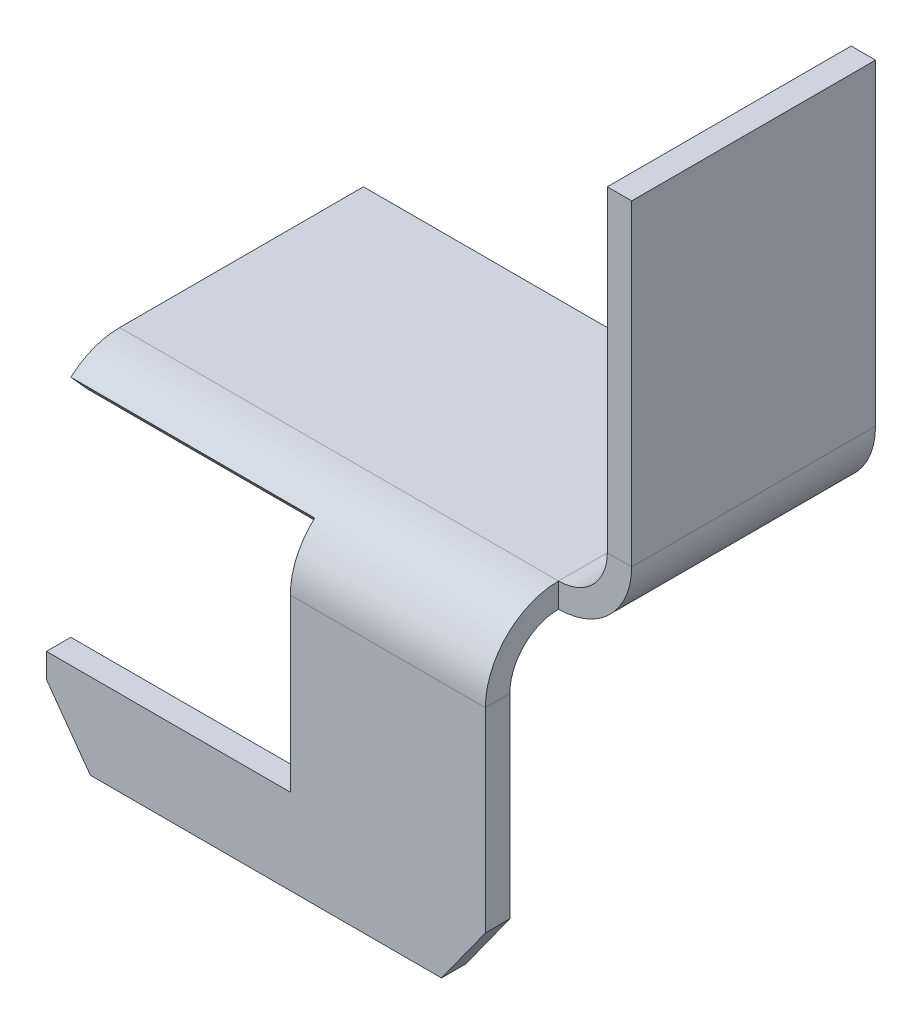
ISO-10303-21;
HEADER;
FILE_DESCRIPTION(('STEP AP214'),'2;1');
FILE_NAME('part.step','',(''),(''),'','','');
FILE_SCHEMA(('AUTOMOTIVE_DESIGN { 1 0 10303 214 1 1 1 1 }'));
ENDSEC;
DATA;
#1=APPLICATION_CONTEXT('core data for automotive mechanical design processes');
#2=APPLICATION_PROTOCOL_DEFINITION('international standard','automotive_design',2000,#1);
#3=PRODUCT_CONTEXT('',#1,'mechanical');
#4=PRODUCT('Part','Part','',(#3));
#5=PRODUCT_RELATED_PRODUCT_CATEGORY('part','',(#4));
#6=PRODUCT_DEFINITION_FORMATION('','',#4);
#7=PRODUCT_DEFINITION_CONTEXT('part definition',#1,'design');
#8=PRODUCT_DEFINITION('design','',#6,#7);
#9=PRODUCT_DEFINITION_SHAPE('','',#8);
#10=(LENGTH_UNIT() NAMED_UNIT(*) SI_UNIT(.MILLI.,.METRE.));
#11=(NAMED_UNIT(*) PLANE_ANGLE_UNIT() SI_UNIT($,.RADIAN.));
#12=(NAMED_UNIT(*) SI_UNIT($,.STERADIAN.) SOLID_ANGLE_UNIT());
#13=UNCERTAINTY_MEASURE_WITH_UNIT(LENGTH_MEASURE(1.E-05),#10,'distance_accuracy_value','');
#14=(GEOMETRIC_REPRESENTATION_CONTEXT(3) GLOBAL_UNCERTAINTY_ASSIGNED_CONTEXT((#13)) GLOBAL_UNIT_ASSIGNED_CONTEXT((#10,
#11,#12)) REPRESENTATION_CONTEXT('',''));
#15=CARTESIAN_POINT('',(0.,0.,0.));
#16=DIRECTION('',(0.,0.,1.));
#17=DIRECTION('',(1.,0.,0.));
#18=AXIS2_PLACEMENT_3D('',#15,#16,#17);
#19=CARTESIAN_POINT('',(0.,0.,13.));
#20=DIRECTION('',(0.,0.,1.));
#21=DIRECTION('',(0.,-1.,0.));
#22=AXIS2_PLACEMENT_3D('',#19,#20,#21);
#23=PLANE('',#22);
#24=DIRECTION('',(-1.,0.,0.));
#25=VECTOR('',#24,1.);
#26=CARTESIAN_POINT('',(0.,-2.99999999999999,13.));
#27=LINE('',#26,#25);
#28=CARTESIAN_POINT('',(18.,-2.99999999999996,13.));
#29=VERTEX_POINT('',#28);
#30=CARTESIAN_POINT('',(10.,-2.99999999999996,13.));
#31=VERTEX_POINT('',#30);
#32=EDGE_CURVE('E368',#29,#31,#27,.T.);
#33=ORIENTED_EDGE('',*,*,#32,.T.);
#34=DIRECTION('',(0.,-1.,0.));
#35=VECTOR('',#34,1.);
#36=CARTESIAN_POINT('',(10.,-9.99999999999991,13.));
#37=LINE('',#36,#35);
#38=CARTESIAN_POINT('',(10.,-9.99999999999991,13.));
#39=VERTEX_POINT('',#38);
#40=EDGE_CURVE('E444',#31,#39,#37,.T.);
#41=ORIENTED_EDGE('',*,*,#40,.T.);
#42=DIRECTION('',(-1.,0.,0.));
#43=VECTOR('',#42,1.);
#44=CARTESIAN_POINT('',(10.,-9.99999999999991,13.));
#45=LINE('',#44,#43);
#46=CARTESIAN_POINT('',(0.,-9.99999999999991,13.));
#47=VERTEX_POINT('',#46);
#48=EDGE_CURVE('E437',#39,#47,#45,.T.);
#49=ORIENTED_EDGE('',*,*,#48,.T.);
#50=DIRECTION('',(0.,1.,0.));
#51=VECTOR('',#50,1.);
#52=CARTESIAN_POINT('',(0.,0.,13.));
#53=LINE('',#52,#51);
#54=CARTESIAN_POINT('',(0.,-11.,13.0000000000001));
#55=VERTEX_POINT('',#54);
#56=EDGE_CURVE('E383',#47,#55,#53,.F.);
#57=ORIENTED_EDGE('',*,*,#56,.T.);
#58=DIRECTION('',(-0.584304725845076,0.811534341451495,0.));
#59=VECTOR('',#58,1.);
#60=CARTESIAN_POINT('',(-5.21601685985251,-3.75553213909373,13.));
#61=LINE('',#60,#59);
#62=CARTESIAN_POINT('',(1.8,-13.5,13.0000000000001));
#63=VERTEX_POINT('',#62);
#64=EDGE_CURVE('E390',#55,#63,#61,.F.);
#65=ORIENTED_EDGE('',*,*,#64,.T.);
#66=DIRECTION('',(-1.,0.,0.));
#67=VECTOR('',#66,1.);
#68=CARTESIAN_POINT('',(0.,-13.5,13.0000000000001));
#69=LINE('',#68,#67);
#70=CARTESIAN_POINT('',(16.2,-13.5,13.0000000000001));
#71=VERTEX_POINT('',#70);
#72=EDGE_CURVE('E388',#63,#71,#69,.F.);
#73=ORIENTED_EDGE('',*,*,#72,.T.);
#74=DIRECTION('',(-0.584304725845076,-0.811534341451495,0.));
#75=VECTOR('',#74,1.);
#76=CARTESIAN_POINT('',(17.0706006322445,-12.290832455216,13.0000000000001));
#77=LINE('',#76,#75);
#78=CARTESIAN_POINT('',(18.,-11.,13.0000000000001));
#79=VERTEX_POINT('',#78);
#80=EDGE_CURVE('E393',#71,#79,#77,.F.);
#81=ORIENTED_EDGE('',*,*,#80,.T.);
#82=DIRECTION('',(0.,-1.,0.));
#83=VECTOR('',#82,1.);
#84=CARTESIAN_POINT('',(18.,0.,13.));
#85=LINE('',#84,#83);
#86=EDGE_CURVE('E397',#79,#29,#85,.F.);
#87=ORIENTED_EDGE('',*,*,#86,.T.);
#88=EDGE_LOOP('',(#33,#41,#49,#57,#65,#73,#81,#87));
#89=FACE_BOUND('',#88,.T.);
#90=ADVANCED_FACE('F180',(#89),#23,.T.);
#91=CARTESIAN_POINT('',(0.,0.,12.));
#92=DIRECTION('',(0.,0.,1.));
#93=DIRECTION('',(0.,-1.,0.));
#94=AXIS2_PLACEMENT_3D('',#91,#92,#93);
#95=PLANE('',#94);
#96=DIRECTION('',(0.,1.,0.));
#97=VECTOR('',#96,1.);
#98=CARTESIAN_POINT('',(10.,-5.38196601125005,12.));
#99=LINE('',#98,#97);
#100=CARTESIAN_POINT('',(10.,-2.99999999999997,12.));
#101=VERTEX_POINT('',#100);
#102=CARTESIAN_POINT('',(10.,-9.99999999999991,12.));
#103=VERTEX_POINT('',#102);
#104=EDGE_CURVE('E438',#101,#103,#99,.F.);
#105=ORIENTED_EDGE('',*,*,#104,.F.);
#106=DIRECTION('',(1.,0.,0.));
#107=VECTOR('',#106,1.);
#108=CARTESIAN_POINT('',(18.,-2.99999999999999,12.));
#109=LINE('',#108,#107);
#110=CARTESIAN_POINT('',(18.,-2.99999999999997,12.));
#111=VERTEX_POINT('',#110);
#112=EDGE_CURVE('E362',#111,#101,#109,.F.);
#113=ORIENTED_EDGE('',*,*,#112,.F.);
#114=DIRECTION('',(0.,1.,0.));
#115=VECTOR('',#114,1.);
#116=CARTESIAN_POINT('',(18.,-1.,12.));
#117=LINE('',#116,#115);
#118=CARTESIAN_POINT('',(18.,-11.,12.0000000000001));
#119=VERTEX_POINT('',#118);
#120=EDGE_CURVE('E381',#119,#111,#117,.T.);
#121=ORIENTED_EDGE('',*,*,#120,.F.);
#122=DIRECTION('',(0.584304725845076,0.811534341451495,0.));
#123=VECTOR('',#122,1.);
#124=CARTESIAN_POINT('',(16.2,-13.5,12.0000000000001));
#125=LINE('',#124,#123);
#126=CARTESIAN_POINT('',(16.2,-13.5,12.0000000000001));
#127=VERTEX_POINT('',#126);
#128=EDGE_CURVE('E378',#127,#119,#125,.T.);
#129=ORIENTED_EDGE('',*,*,#128,.F.);
#130=DIRECTION('',(1.,0.,0.));
#131=VECTOR('',#130,1.);
#132=CARTESIAN_POINT('',(1.8,-13.5,12.0000000000001));
#133=LINE('',#132,#131);
#134=CARTESIAN_POINT('',(1.8,-13.5,12.0000000000001));
#135=VERTEX_POINT('',#134);
#136=EDGE_CURVE('E374',#135,#127,#133,.T.);
#137=ORIENTED_EDGE('',*,*,#136,.F.);
#138=DIRECTION('',(0.584304725845076,-0.811534341451495,0.));
#139=VECTOR('',#138,1.);
#140=CARTESIAN_POINT('',(0.,-11.,12.0000000000001));
#141=LINE('',#140,#139);
#142=CARTESIAN_POINT('',(0.,-11.,12.0000000000001));
#143=VERTEX_POINT('',#142);
#144=EDGE_CURVE('E375',#143,#135,#141,.T.);
#145=ORIENTED_EDGE('',*,*,#144,.F.);
#146=DIRECTION('',(0.,-1.,0.));
#147=VECTOR('',#146,1.);
#148=CARTESIAN_POINT('',(0.,-1.,12.));
#149=LINE('',#148,#147);
#150=CARTESIAN_POINT('',(0.,-9.99999999999991,12.));
#151=VERTEX_POINT('',#150);
#152=EDGE_CURVE('E369',#151,#143,#149,.T.);
#153=ORIENTED_EDGE('',*,*,#152,.F.);
#154=DIRECTION('',(1.,0.,0.));
#155=VECTOR('',#154,1.);
#156=CARTESIAN_POINT('',(5.,-9.99999999999991,12.));
#157=LINE('',#156,#155);
#158=EDGE_CURVE('E195',#103,#151,#157,.F.);
#159=ORIENTED_EDGE('',*,*,#158,.F.);
#160=EDGE_LOOP('',(#105,#113,#121,#129,#137,#145,#153,#159));
#161=FACE_BOUND('',#160,.T.);
#162=ADVANCED_FACE('F522',(#161),#95,.F.);
#163=CARTESIAN_POINT('',(0.,-2.99999999999999,10.));
#164=DIRECTION('',(-1.,0.,0.));
#165=DIRECTION('',(0.,0.,1.));
#166=AXIS2_PLACEMENT_3D('',#163,#164,#165);
#167=CYLINDRICAL_SURFACE('',#166,3.);
#168=CARTESIAN_POINT('',(0.,-2.99999999999999,10.));
#169=DIRECTION('',(-1.,0.,0.));
#170=DIRECTION('',(0.,0.,1.));
#171=AXIS2_PLACEMENT_3D('',#168,#169,#170);
#172=CIRCLE('',#171,3.);
#173=CARTESIAN_POINT('',(0.,-0.763932022500181,12.));
#174=VERTEX_POINT('',#173);
#175=CARTESIAN_POINT('',(0.,0.,10.));
#176=VERTEX_POINT('',#175);
#177=EDGE_CURVE('E357',#174,#176,#172,.T.);
#178=ORIENTED_EDGE('',*,*,#177,.F.);
#179=DIRECTION('',(-1.,0.,0.));
#180=VECTOR('',#179,1.);
#181=CARTESIAN_POINT('',(0.,-0.763932022500181,12.));
#182=LINE('',#181,#180);
#183=CARTESIAN_POINT('',(10.,-0.763932022500181,12.));
#184=VERTEX_POINT('',#183);
#185=EDGE_CURVE('E426',#174,#184,#182,.F.);
#186=ORIENTED_EDGE('',*,*,#185,.T.);
#187=CARTESIAN_POINT('',(10.,-2.99999999999999,10.));
#188=DIRECTION('',(1.,0.,0.));
#189=DIRECTION('',(0.,0.,-1.));
#190=AXIS2_PLACEMENT_3D('',#187,#188,#189);
#191=CIRCLE('',#190,3.);
#192=EDGE_CURVE('E425',#31,#184,#191,.F.);
#193=ORIENTED_EDGE('',*,*,#192,.F.);
#194=ORIENTED_EDGE('',*,*,#32,.F.);
#195=CARTESIAN_POINT('',(18.,-2.99999999999999,10.));
#196=DIRECTION('',(-1.,0.,0.));
#197=DIRECTION('',(0.,0.,1.));
#198=AXIS2_PLACEMENT_3D('',#195,#196,#197);
#199=CIRCLE('',#198,3.);
#200=CARTESIAN_POINT('',(18.,0.,10.));
#201=VERTEX_POINT('',#200);
#202=EDGE_CURVE('E294',#201,#29,#199,.F.);
#203=ORIENTED_EDGE('',*,*,#202,.F.);
#204=DIRECTION('',(1.,0.,0.));
#205=VECTOR('',#204,1.);
#206=CARTESIAN_POINT('',(0.,0.,10.));
#207=LINE('',#206,#205);
#208=EDGE_CURVE('E280',#176,#201,#207,.T.);
#209=ORIENTED_EDGE('',*,*,#208,.F.);
#210=EDGE_LOOP('',(#178,#186,#193,#194,#203,#209));
#211=FACE_BOUND('',#210,.T.);
#212=ADVANCED_FACE('F473',(#211),#167,.T.);
#213=CARTESIAN_POINT('',(0.,-2.99999999999999,10.));
#214=DIRECTION('',(-1.,0.,0.));
#215=DIRECTION('',(0.,0.,1.));
#216=AXIS2_PLACEMENT_3D('',#213,#214,#215);
#217=CYLINDRICAL_SURFACE('',#216,2.);
#218=CARTESIAN_POINT('',(10.,-2.99999999999999,10.));
#219=DIRECTION('',(-1.,0.,0.));
#220=DIRECTION('',(0.,0.,1.));
#221=AXIS2_PLACEMENT_3D('',#218,#219,#220);
#222=CIRCLE('',#221,2.);
#223=CARTESIAN_POINT('',(10.,-1.50928801500012,11.3333333333333));
#224=VERTEX_POINT('',#223);
#225=EDGE_CURVE('E417',#101,#224,#222,.T.);
#226=ORIENTED_EDGE('',*,*,#225,.T.);
#227=DIRECTION('',(-1.,0.,0.));
#228=VECTOR('',#227,1.);
#229=CARTESIAN_POINT('',(0.,-1.50928801500012,11.3333333333333));
#230=LINE('',#229,#228);
#231=CARTESIAN_POINT('',(0.,-1.50928801500012,11.3333333333333));
#232=VERTEX_POINT('',#231);
#233=EDGE_CURVE('E422',#232,#224,#230,.F.);
#234=ORIENTED_EDGE('',*,*,#233,.F.);
#235=CARTESIAN_POINT('',(0.,-2.99999999999999,10.));
#236=DIRECTION('',(-1.,0.,0.));
#237=DIRECTION('',(0.,0.,1.));
#238=AXIS2_PLACEMENT_3D('',#235,#236,#237);
#239=CIRCLE('',#238,2.);
#240=CARTESIAN_POINT('',(0.,-0.999999999999985,10.));
#241=VERTEX_POINT('',#240);
#242=EDGE_CURVE('E352',#232,#241,#239,.T.);
#243=ORIENTED_EDGE('',*,*,#242,.T.);
#244=DIRECTION('',(1.,0.,0.));
#245=VECTOR('',#244,1.);
#246=CARTESIAN_POINT('',(0.,-1.,10.));
#247=LINE('',#246,#245);
#248=CARTESIAN_POINT('',(18.,-0.999999999999985,10.));
#249=VERTEX_POINT('',#248);
#250=EDGE_CURVE('E281',#241,#249,#247,.T.);
#251=ORIENTED_EDGE('',*,*,#250,.T.);
#252=CARTESIAN_POINT('',(18.,-2.99999999999999,10.));
#253=DIRECTION('',(-1.,0.,0.));
#254=DIRECTION('',(0.,0.,1.));
#255=AXIS2_PLACEMENT_3D('',#252,#253,#254);
#256=CIRCLE('',#255,2.);
#257=EDGE_CURVE('E337',#249,#111,#256,.F.);
#258=ORIENTED_EDGE('',*,*,#257,.T.);
#259=ORIENTED_EDGE('',*,*,#112,.T.);
#260=EDGE_LOOP('',(#226,#234,#243,#251,#258,#259));
#261=FACE_BOUND('',#260,.T.);
#262=ADVANCED_FACE('F491',(#261),#217,.F.);
#263=CARTESIAN_POINT('',(0.,-0.999999999999993,13.));
#264=DIRECTION('',(1.,0.,0.));
#265=DIRECTION('',(0.,0.,-1.));
#266=AXIS2_PLACEMENT_3D('',#263,#264,#265);
#267=PLANE('',#266);
#268=DIRECTION('',(0.,0.745355992499935,0.666666666666661));
#269=VECTOR('',#268,1.);
#270=CARTESIAN_POINT('',(0.,-0.763932022500181,12.));
#271=LINE('',#270,#269);
#272=EDGE_CURVE('E414',#174,#232,#271,.F.);
#273=ORIENTED_EDGE('',*,*,#272,.F.);
#274=ORIENTED_EDGE('',*,*,#177,.T.);
#275=DIRECTION('',(0.,1.,0.));
#276=VECTOR('',#275,1.);
#277=CARTESIAN_POINT('',(0.,-1.,10.));
#278=LINE('',#277,#276);
#279=EDGE_CURVE('E276',#241,#176,#278,.T.);
#280=ORIENTED_EDGE('',*,*,#279,.F.);
#281=ORIENTED_EDGE('',*,*,#242,.F.);
#282=EDGE_LOOP('',(#273,#274,#280,#281));
#283=FACE_BOUND('',#282,.T.);
#284=ADVANCED_FACE('F484',(#283),#267,.F.);
#285=DIRECTION('',(0.,0.,-1.));
#286=VECTOR('',#285,1.);
#287=CARTESIAN_POINT('',(0.,-9.99999999999991,13.));
#288=LINE('',#287,#286);
#289=EDGE_CURVE('E436',#151,#47,#288,.F.);
#290=ORIENTED_EDGE('',*,*,#289,.F.);
#291=ORIENTED_EDGE('',*,*,#152,.T.);
#292=DIRECTION('',(0.,0.,-1.));
#293=VECTOR('',#292,1.);
#294=CARTESIAN_POINT('',(0.,-11.,13.0000000000001));
#295=LINE('',#294,#293);
#296=EDGE_CURVE('E354',#55,#143,#295,.T.);
#297=ORIENTED_EDGE('',*,*,#296,.F.);
#298=ORIENTED_EDGE('',*,*,#56,.F.);
#299=EDGE_LOOP('',(#290,#291,#297,#298));
#300=FACE_BOUND('',#299,.T.);
#301=ADVANCED_FACE('F520',(#300),#267,.F.);
#302=CARTESIAN_POINT('',(20.,2.,10.));
#303=DIRECTION('',(0.,0.,1.));
#304=DIRECTION('',(1.,0.,0.));
#305=AXIS2_PLACEMENT_3D('',#302,#303,#304);
#306=PLANE('',#305);
#307=DIRECTION('',(1.,0.,0.));
#308=VECTOR('',#307,1.);
#309=CARTESIAN_POINT('',(20.,2.,10.));
#310=LINE('',#309,#308);
#311=CARTESIAN_POINT('',(20.,2.,10.));
#312=VERTEX_POINT('',#311);
#313=CARTESIAN_POINT('',(21.,2.,10.));
#314=VERTEX_POINT('',#313);
#315=EDGE_CURVE('E13',#312,#314,#310,.T.);
#316=ORIENTED_EDGE('',*,*,#315,.F.);
#317=CARTESIAN_POINT('',(18.,2.,10.));
#318=DIRECTION('',(0.,0.,-1.));
#319=DIRECTION('',(-1.,0.,0.));
#320=AXIS2_PLACEMENT_3D('',#317,#318,#319);
#321=CIRCLE('',#320,2.);
#322=EDGE_CURVE('E253',#201,#312,#321,.F.);
#323=ORIENTED_EDGE('',*,*,#322,.F.);
#324=DIRECTION('',(0.,1.,0.));
#325=VECTOR('',#324,1.);
#326=CARTESIAN_POINT('',(18.,-1.,10.));
#327=LINE('',#326,#325);
#328=EDGE_CURVE('E183',#249,#201,#327,.T.);
#329=ORIENTED_EDGE('',*,*,#328,.F.);
#330=CARTESIAN_POINT('',(18.,2.,10.));
#331=DIRECTION('',(0.,0.,1.));
#332=DIRECTION('',(1.,0.,0.));
#333=AXIS2_PLACEMENT_3D('',#330,#331,#332);
#334=CIRCLE('',#333,3.);
#335=EDGE_CURVE('E255',#249,#314,#334,.T.);
#336=ORIENTED_EDGE('',*,*,#335,.T.);
#337=EDGE_LOOP('',(#316,#323,#329,#336));
#338=FACE_BOUND('',#337,.T.);
#339=ADVANCED_FACE('F176',(#338),#306,.T.);
#340=CARTESIAN_POINT('',(18.,-1.,10.));
#341=DIRECTION('',(0.,0.,1.));
#342=DIRECTION('',(1.,0.,0.));
#343=AXIS2_PLACEMENT_3D('',#340,#341,#342);
#344=PLANE('',#343);
#345=DIRECTION('',(0.,1.,0.));
#346=VECTOR('',#345,1.);
#347=CARTESIAN_POINT('',(20.,0.,10.));
#348=LINE('',#347,#346);
#349=CARTESIAN_POINT('',(20.,15.,10.));
#350=VERTEX_POINT('',#349);
#351=EDGE_CURVE('E265',#312,#350,#348,.T.);
#352=ORIENTED_EDGE('',*,*,#351,.F.);
#353=ORIENTED_EDGE('',*,*,#315,.T.);
#354=DIRECTION('',(0.,1.,0.));
#355=VECTOR('',#354,1.);
#356=CARTESIAN_POINT('',(21.,0.,10.));
#357=LINE('',#356,#355);
#358=CARTESIAN_POINT('',(21.,15.,10.));
#359=VERTEX_POINT('',#358);
#360=EDGE_CURVE('E239',#314,#359,#357,.T.);
#361=ORIENTED_EDGE('',*,*,#360,.T.);
#362=DIRECTION('',(1.,0.,0.));
#363=VECTOR('',#362,1.);
#364=CARTESIAN_POINT('',(20.,15.,10.));
#365=LINE('',#364,#363);
#366=EDGE_CURVE('E275',#350,#359,#365,.T.);
#367=ORIENTED_EDGE('',*,*,#366,.F.);
#368=EDGE_LOOP('',(#352,#353,#361,#367));
#369=FACE_BOUND('',#368,.T.);
#370=ADVANCED_FACE('F269',(#369),#344,.T.);
#371=CARTESIAN_POINT('',(18.,0.,0.));
#372=DIRECTION('',(0.,0.,-1.));
#373=DIRECTION('',(-1.,0.,0.));
#374=AXIS2_PLACEMENT_3D('',#371,#372,#373);
#375=PLANE('',#374);
#376=DIRECTION('',(0.,-1.,0.));
#377=VECTOR('',#376,1.);
#378=CARTESIAN_POINT('',(18.,0.,0.));
#379=LINE('',#378,#377);
#380=CARTESIAN_POINT('',(18.,0.,0.));
#381=VERTEX_POINT('',#380);
#382=CARTESIAN_POINT('',(18.,-1.,0.));
#383=VERTEX_POINT('',#382);
#384=EDGE_CURVE('E324',#381,#383,#379,.T.);
#385=ORIENTED_EDGE('',*,*,#384,.F.);
#386=CARTESIAN_POINT('',(18.,2.,0.));
#387=DIRECTION('',(0.,0.,-1.));
#388=DIRECTION('',(-1.,0.,0.));
#389=AXIS2_PLACEMENT_3D('',#386,#387,#388);
#390=CIRCLE('',#389,2.);
#391=CARTESIAN_POINT('',(20.,2.,0.));
#392=VERTEX_POINT('',#391);
#393=EDGE_CURVE('E298',#381,#392,#390,.F.);
#394=ORIENTED_EDGE('',*,*,#393,.T.);
#395=DIRECTION('',(-1.,0.,0.));
#396=VECTOR('',#395,1.);
#397=CARTESIAN_POINT('',(21.,2.,0.));
#398=LINE('',#397,#396);
#399=CARTESIAN_POINT('',(21.,2.,0.));
#400=VERTEX_POINT('',#399);
#401=EDGE_CURVE('E234',#400,#392,#398,.T.);
#402=ORIENTED_EDGE('',*,*,#401,.F.);
#403=CARTESIAN_POINT('',(18.,2.,0.));
#404=DIRECTION('',(0.,0.,1.));
#405=DIRECTION('',(1.,0.,0.));
#406=AXIS2_PLACEMENT_3D('',#403,#404,#405);
#407=CIRCLE('',#406,3.);
#408=EDGE_CURVE('E310',#383,#400,#407,.T.);
#409=ORIENTED_EDGE('',*,*,#408,.F.);
#410=EDGE_LOOP('',(#385,#394,#402,#409));
#411=FACE_BOUND('',#410,.T.);
#412=ADVANCED_FACE('F602',(#411),#375,.T.);
#413=CARTESIAN_POINT('',(21.,2.,0.));
#414=DIRECTION('',(0.,0.,-1.));
#415=DIRECTION('',(-1.,0.,0.));
#416=AXIS2_PLACEMENT_3D('',#413,#414,#415);
#417=PLANE('',#416);
#418=DIRECTION('',(1.,0.,0.));
#419=VECTOR('',#418,1.);
#420=CARTESIAN_POINT('',(0.,0.,0.));
#421=LINE('',#420,#419);
#422=CARTESIAN_POINT('',(0.,0.,0.));
#423=VERTEX_POINT('',#422);
#424=EDGE_CURVE('E296',#423,#381,#421,.T.);
#425=ORIENTED_EDGE('',*,*,#424,.T.);
#426=ORIENTED_EDGE('',*,*,#384,.T.);
#427=DIRECTION('',(1.,0.,0.));
#428=VECTOR('',#427,1.);
#429=CARTESIAN_POINT('',(0.,-1.,0.));
#430=LINE('',#429,#428);
#431=CARTESIAN_POINT('',(0.,-1.,0.));
#432=VERTEX_POINT('',#431);
#433=EDGE_CURVE('E308',#432,#383,#430,.T.);
#434=ORIENTED_EDGE('',*,*,#433,.F.);
#435=DIRECTION('',(0.,1.,0.));
#436=VECTOR('',#435,1.);
#437=CARTESIAN_POINT('',(0.,-1.,0.));
#438=LINE('',#437,#436);
#439=EDGE_CURVE('E304',#432,#423,#438,.T.);
#440=ORIENTED_EDGE('',*,*,#439,.T.);
#441=EDGE_LOOP('',(#425,#426,#434,#440));
#442=FACE_BOUND('',#441,.T.);
#443=ADVANCED_FACE('F599',(#442),#417,.T.);
#444=CARTESIAN_POINT('',(21.,0.,10.));
#445=DIRECTION('',(-1.,0.,0.));
#446=DIRECTION('',(0.,0.,1.));
#447=AXIS2_PLACEMENT_3D('',#444,#445,#446);
#448=PLANE('',#447);
#449=DIRECTION('',(0.,1.,0.));
#450=VECTOR('',#449,1.);
#451=CARTESIAN_POINT('',(21.,0.,0.));
#452=LINE('',#451,#450);
#453=CARTESIAN_POINT('',(21.,15.,0.));
#454=VERTEX_POINT('',#453);
#455=EDGE_CURVE('E288',#400,#454,#452,.T.);
#456=ORIENTED_EDGE('',*,*,#455,.T.);
#457=DIRECTION('',(0.,0.,-1.));
#458=VECTOR('',#457,1.);
#459=CARTESIAN_POINT('',(21.,15.,10.));
#460=LINE('',#459,#458);
#461=EDGE_CURVE('E325',#359,#454,#460,.T.);
#462=ORIENTED_EDGE('',*,*,#461,.F.);
#463=ORIENTED_EDGE('',*,*,#360,.F.);
#464=DIRECTION('',(0.,0.,-1.));
#465=VECTOR('',#464,1.);
#466=CARTESIAN_POINT('',(21.,2.,10.));
#467=LINE('',#466,#465);
#468=EDGE_CURVE('E286',#314,#400,#467,.T.);
#469=ORIENTED_EDGE('',*,*,#468,.T.);
#470=EDGE_LOOP('',(#456,#462,#463,#469));
#471=FACE_BOUND('',#470,.T.);
#472=ADVANCED_FACE('F346',(#471),#448,.F.);
#473=CARTESIAN_POINT('',(20.,15.,10.));
#474=DIRECTION('',(0.,1.,0.));
#475=DIRECTION('',(0.,0.,1.));
#476=AXIS2_PLACEMENT_3D('',#473,#474,#475);
#477=PLANE('',#476);
#478=DIRECTION('',(1.,0.,0.));
#479=VECTOR('',#478,1.);
#480=CARTESIAN_POINT('',(20.,15.,0.));
#481=LINE('',#480,#479);
#482=CARTESIAN_POINT('',(20.,15.,0.));
#483=VERTEX_POINT('',#482);
#484=EDGE_CURVE('E291',#483,#454,#481,.T.);
#485=ORIENTED_EDGE('',*,*,#484,.F.);
#486=DIRECTION('',(0.,0.,-1.));
#487=VECTOR('',#486,1.);
#488=CARTESIAN_POINT('',(20.,15.,10.));
#489=LINE('',#488,#487);
#490=EDGE_CURVE('E270',#350,#483,#489,.T.);
#491=ORIENTED_EDGE('',*,*,#490,.F.);
#492=ORIENTED_EDGE('',*,*,#366,.T.);
#493=ORIENTED_EDGE('',*,*,#461,.T.);
#494=EDGE_LOOP('',(#485,#491,#492,#493));
#495=FACE_BOUND('',#494,.T.);
#496=ADVANCED_FACE('F592',(#495),#477,.T.);
#497=CARTESIAN_POINT('',(20.,0.,10.));
#498=DIRECTION('',(-1.,0.,0.));
#499=DIRECTION('',(0.,0.,1.));
#500=AXIS2_PLACEMENT_3D('',#497,#498,#499);
#501=PLANE('',#500);
#502=DIRECTION('',(0.,1.,0.));
#503=VECTOR('',#502,1.);
#504=CARTESIAN_POINT('',(20.,0.,0.));
#505=LINE('',#504,#503);
#506=EDGE_CURVE('E262',#392,#483,#505,.T.);
#507=ORIENTED_EDGE('',*,*,#506,.F.);
#508=DIRECTION('',(0.,0.,-1.));
#509=VECTOR('',#508,1.);
#510=CARTESIAN_POINT('',(20.,2.,10.));
#511=LINE('',#510,#509);
#512=EDGE_CURVE('E257',#312,#392,#511,.T.);
#513=ORIENTED_EDGE('',*,*,#512,.F.);
#514=ORIENTED_EDGE('',*,*,#351,.T.);
#515=ORIENTED_EDGE('',*,*,#490,.T.);
#516=EDGE_LOOP('',(#507,#513,#514,#515));
#517=FACE_BOUND('',#516,.T.);
#518=ADVANCED_FACE('F261',(#517),#501,.T.);
#519=CARTESIAN_POINT('',(18.,2.,10.));
#520=DIRECTION('',(0.,0.,-1.));
#521=DIRECTION('',(-1.,0.,0.));
#522=AXIS2_PLACEMENT_3D('',#519,#520,#521);
#523=CYLINDRICAL_SURFACE('',#522,2.);
#524=ORIENTED_EDGE('',*,*,#393,.F.);
#525=DIRECTION('',(0.,0.,-1.));
#526=VECTOR('',#525,1.);
#527=CARTESIAN_POINT('',(18.,0.,10.));
#528=LINE('',#527,#526);
#529=EDGE_CURVE('E268',#201,#381,#528,.T.);
#530=ORIENTED_EDGE('',*,*,#529,.F.);
#531=ORIENTED_EDGE('',*,*,#322,.T.);
#532=ORIENTED_EDGE('',*,*,#512,.T.);
#533=EDGE_LOOP('',(#524,#530,#531,#532));
#534=FACE_BOUND('',#533,.T.);
#535=ADVANCED_FACE('F274',(#534),#523,.F.);
#536=CARTESIAN_POINT('',(0.,0.,10.));
#537=DIRECTION('',(0.,1.,0.));
#538=DIRECTION('',(0.,0.,1.));
#539=AXIS2_PLACEMENT_3D('',#536,#537,#538);
#540=PLANE('',#539);
#541=ORIENTED_EDGE('',*,*,#424,.F.);
#542=DIRECTION('',(0.,0.,-1.));
#543=VECTOR('',#542,1.);
#544=CARTESIAN_POINT('',(0.,0.,10.));
#545=LINE('',#544,#543);
#546=EDGE_CURVE('E318',#176,#423,#545,.T.);
#547=ORIENTED_EDGE('',*,*,#546,.F.);
#548=ORIENTED_EDGE('',*,*,#208,.T.);
#549=ORIENTED_EDGE('',*,*,#529,.T.);
#550=EDGE_LOOP('',(#541,#547,#548,#549));
#551=FACE_BOUND('',#550,.T.);
#552=ADVANCED_FACE('F584',(#551),#540,.T.);
#553=CARTESIAN_POINT('',(0.,-1.,10.));
#554=DIRECTION('',(-1.,0.,0.));
#555=DIRECTION('',(0.,0.,1.));
#556=AXIS2_PLACEMENT_3D('',#553,#554,#555);
#557=PLANE('',#556);
#558=ORIENTED_EDGE('',*,*,#439,.F.);
#559=DIRECTION('',(0.,0.,-1.));
#560=VECTOR('',#559,1.);
#561=CARTESIAN_POINT('',(0.,-1.,10.));
#562=LINE('',#561,#560);
#563=EDGE_CURVE('E316',#241,#432,#562,.T.);
#564=ORIENTED_EDGE('',*,*,#563,.F.);
#565=ORIENTED_EDGE('',*,*,#279,.T.);
#566=ORIENTED_EDGE('',*,*,#546,.T.);
#567=EDGE_LOOP('',(#558,#564,#565,#566));
#568=FACE_BOUND('',#567,.T.);
#569=ADVANCED_FACE('F582',(#568),#557,.T.);
#570=CARTESIAN_POINT('',(0.,-1.,10.));
#571=DIRECTION('',(0.,1.,0.));
#572=DIRECTION('',(0.,0.,1.));
#573=AXIS2_PLACEMENT_3D('',#570,#571,#572);
#574=PLANE('',#573);
#575=ORIENTED_EDGE('',*,*,#433,.T.);
#576=DIRECTION('',(0.,0.,-1.));
#577=VECTOR('',#576,1.);
#578=CARTESIAN_POINT('',(18.,-1.,10.));
#579=LINE('',#578,#577);
#580=EDGE_CURVE('E311',#249,#383,#579,.T.);
#581=ORIENTED_EDGE('',*,*,#580,.F.);
#582=ORIENTED_EDGE('',*,*,#250,.F.);
#583=ORIENTED_EDGE('',*,*,#563,.T.);
#584=EDGE_LOOP('',(#575,#581,#582,#583));
#585=FACE_BOUND('',#584,.T.);
#586=ADVANCED_FACE('F345',(#585),#574,.F.);
#587=CARTESIAN_POINT('',(18.,2.,10.));
#588=DIRECTION('',(0.,0.,-1.));
#589=DIRECTION('',(-1.,0.,0.));
#590=AXIS2_PLACEMENT_3D('',#587,#588,#589);
#591=CYLINDRICAL_SURFACE('',#590,3.);
#592=ORIENTED_EDGE('',*,*,#408,.T.);
#593=ORIENTED_EDGE('',*,*,#468,.F.);
#594=ORIENTED_EDGE('',*,*,#335,.F.);
#595=ORIENTED_EDGE('',*,*,#580,.T.);
#596=EDGE_LOOP('',(#592,#593,#594,#595));
#597=FACE_BOUND('',#596,.T.);
#598=ADVANCED_FACE('F343',(#597),#591,.T.);
#599=CARTESIAN_POINT('',(18.,2.,0.));
#600=DIRECTION('',(0.,0.,-1.));
#601=DIRECTION('',(-1.,0.,0.));
#602=AXIS2_PLACEMENT_3D('',#599,#600,#601);
#603=PLANE('',#602);
#604=ORIENTED_EDGE('',*,*,#455,.F.);
#605=ORIENTED_EDGE('',*,*,#401,.T.);
#606=ORIENTED_EDGE('',*,*,#506,.T.);
#607=ORIENTED_EDGE('',*,*,#484,.T.);
#608=EDGE_LOOP('',(#604,#605,#606,#607));
#609=FACE_BOUND('',#608,.T.);
#610=ADVANCED_FACE('F574',(#609),#603,.T.);
#611=CARTESIAN_POINT('',(18.,-2.99999999999999,10.));
#612=DIRECTION('',(1.,0.,0.));
#613=DIRECTION('',(0.,0.,-1.));
#614=AXIS2_PLACEMENT_3D('',#611,#612,#613);
#615=PLANE('',#614);
#616=DIRECTION('',(0.,0.,-1.));
#617=VECTOR('',#616,1.);
#618=CARTESIAN_POINT('',(18.,-2.99999999999999,13.));
#619=LINE('',#618,#617);
#620=EDGE_CURVE('E358',#111,#29,#619,.F.);
#621=ORIENTED_EDGE('',*,*,#620,.F.);
#622=ORIENTED_EDGE('',*,*,#257,.F.);
#623=ORIENTED_EDGE('',*,*,#328,.T.);
#624=ORIENTED_EDGE('',*,*,#202,.T.);
#625=EDGE_LOOP('',(#621,#622,#623,#624));
#626=FACE_BOUND('',#625,.T.);
#627=ADVANCED_FACE('F332',(#626),#615,.T.);
#628=CARTESIAN_POINT('',(18.,-0.999999999999993,13.));
#629=DIRECTION('',(-1.,0.,0.));
#630=DIRECTION('',(0.,0.,1.));
#631=AXIS2_PLACEMENT_3D('',#628,#629,#630);
#632=PLANE('',#631);
#633=ORIENTED_EDGE('',*,*,#620,.T.);
#634=ORIENTED_EDGE('',*,*,#86,.F.);
#635=DIRECTION('',(0.,0.,-1.));
#636=VECTOR('',#635,1.);
#637=CARTESIAN_POINT('',(18.,-11.,13.0000000000001));
#638=LINE('',#637,#636);
#639=EDGE_CURVE('E396',#79,#119,#638,.T.);
#640=ORIENTED_EDGE('',*,*,#639,.T.);
#641=ORIENTED_EDGE('',*,*,#120,.T.);
#642=EDGE_LOOP('',(#633,#634,#640,#641));
#643=FACE_BOUND('',#642,.T.);
#644=ADVANCED_FACE('F537',(#643),#632,.F.);
#645=CARTESIAN_POINT('',(0.,-11.,13.0000000000001));
#646=DIRECTION('',(0.811534341451495,0.584304725845076,0.));
#647=DIRECTION('',(-0.584304725845076,0.811534341451495,0.));
#648=AXIS2_PLACEMENT_3D('',#645,#646,#647);
#649=PLANE('',#648);
#650=ORIENTED_EDGE('',*,*,#144,.T.);
#651=DIRECTION('',(0.,0.,-1.));
#652=VECTOR('',#651,1.);
#653=CARTESIAN_POINT('',(1.8,-13.5,13.0000000000001));
#654=LINE('',#653,#652);
#655=EDGE_CURVE('E403',#63,#135,#654,.T.);
#656=ORIENTED_EDGE('',*,*,#655,.F.);
#657=ORIENTED_EDGE('',*,*,#64,.F.);
#658=ORIENTED_EDGE('',*,*,#296,.T.);
#659=EDGE_LOOP('',(#650,#656,#657,#658));
#660=FACE_BOUND('',#659,.T.);
#661=ADVANCED_FACE('F527',(#660),#649,.F.);
#662=CARTESIAN_POINT('',(1.8,-13.5,13.0000000000001));
#663=DIRECTION('',(0.,1.,0.));
#664=DIRECTION('',(0.,0.,1.));
#665=AXIS2_PLACEMENT_3D('',#662,#663,#664);
#666=PLANE('',#665);
#667=ORIENTED_EDGE('',*,*,#136,.T.);
#668=DIRECTION('',(0.,0.,-1.));
#669=VECTOR('',#668,1.);
#670=CARTESIAN_POINT('',(16.2,-13.5,13.0000000000001));
#671=LINE('',#670,#669);
#672=EDGE_CURVE('E405',#71,#127,#671,.T.);
#673=ORIENTED_EDGE('',*,*,#672,.F.);
#674=ORIENTED_EDGE('',*,*,#72,.F.);
#675=ORIENTED_EDGE('',*,*,#655,.T.);
#676=EDGE_LOOP('',(#667,#673,#674,#675));
#677=FACE_BOUND('',#676,.T.);
#678=ADVANCED_FACE('F531',(#677),#666,.F.);
#679=CARTESIAN_POINT('',(16.2,-13.5,13.0000000000001));
#680=DIRECTION('',(-0.811534341451495,0.584304725845076,0.));
#681=DIRECTION('',(-0.584304725845076,-0.811534341451495,0.));
#682=AXIS2_PLACEMENT_3D('',#679,#680,#681);
#683=PLANE('',#682);
#684=ORIENTED_EDGE('',*,*,#128,.T.);
#685=ORIENTED_EDGE('',*,*,#639,.F.);
#686=ORIENTED_EDGE('',*,*,#80,.F.);
#687=ORIENTED_EDGE('',*,*,#672,.T.);
#688=EDGE_LOOP('',(#684,#685,#686,#687));
#689=FACE_BOUND('',#688,.T.);
#690=ADVANCED_FACE('F532',(#689),#683,.F.);
#691=CARTESIAN_POINT('',(10.,-2.99999999999999,10.));
#692=DIRECTION('',(-1.,0.,0.));
#693=DIRECTION('',(0.,0.,1.));
#694=AXIS2_PLACEMENT_3D('',#691,#692,#693);
#695=PLANE('',#694);
#696=DIRECTION('',(0.,-1.,0.));
#697=VECTOR('',#696,1.);
#698=CARTESIAN_POINT('',(10.,-2.99999999999997,12.));
#699=LINE('',#698,#697);
#700=EDGE_CURVE('E361',#184,#101,#699,.T.);
#701=ORIENTED_EDGE('',*,*,#700,.T.);
#702=DIRECTION('',(0.,0.,1.));
#703=VECTOR('',#702,1.);
#704=CARTESIAN_POINT('',(10.,-2.99999999999996,13.0000000000002));
#705=LINE('',#704,#703);
#706=EDGE_CURVE('E415',#31,#101,#705,.F.);
#707=ORIENTED_EDGE('',*,*,#706,.F.);
#708=ORIENTED_EDGE('',*,*,#192,.T.);
#709=EDGE_LOOP('',(#701,#707,#708));
#710=FACE_BOUND('',#709,.T.);
#711=ADVANCED_FACE('F461',(#710),#695,.T.);
#712=DIRECTION('',(0.,0.745355992499935,0.666666666666661));
#713=VECTOR('',#712,1.);
#714=CARTESIAN_POINT('',(10.,-0.763932022500181,12.));
#715=LINE('',#714,#713);
#716=EDGE_CURVE('E418',#184,#224,#715,.F.);
#717=ORIENTED_EDGE('',*,*,#716,.T.);
#718=ORIENTED_EDGE('',*,*,#225,.F.);
#719=ORIENTED_EDGE('',*,*,#700,.F.);
#720=EDGE_LOOP('',(#717,#718,#719));
#721=FACE_BOUND('',#720,.T.);
#722=ADVANCED_FACE('F545',(#721),#695,.T.);
#723=CARTESIAN_POINT('',(5.,-0.763932022500181,12.));
#724=DIRECTION('',(0.,0.666666666666661,-0.745355992499935));
#725=DIRECTION('',(-1.,0.,0.));
#726=AXIS2_PLACEMENT_3D('',#723,#724,#725);
#727=PLANE('',#726);
#728=ORIENTED_EDGE('',*,*,#716,.F.);
#729=ORIENTED_EDGE('',*,*,#185,.F.);
#730=ORIENTED_EDGE('',*,*,#272,.T.);
#731=ORIENTED_EDGE('',*,*,#233,.T.);
#732=EDGE_LOOP('',(#728,#729,#730,#731));
#733=FACE_BOUND('',#732,.T.);
#734=ADVANCED_FACE('F479',(#733),#727,.F.);
#735=CARTESIAN_POINT('',(10.,-9.99999999999991,13.));
#736=DIRECTION('',(1.,0.,0.));
#737=DIRECTION('',(0.,-1.,0.));
#738=AXIS2_PLACEMENT_3D('',#735,#736,#737);
#739=PLANE('',#738);
#740=ORIENTED_EDGE('',*,*,#706,.T.);
#741=ORIENTED_EDGE('',*,*,#104,.T.);
#742=DIRECTION('',(0.,0.,-1.));
#743=VECTOR('',#742,1.);
#744=CARTESIAN_POINT('',(10.,-9.99999999999991,13.));
#745=LINE('',#744,#743);
#746=EDGE_CURVE('E427',#103,#39,#745,.F.);
#747=ORIENTED_EDGE('',*,*,#746,.T.);
#748=ORIENTED_EDGE('',*,*,#40,.F.);
#749=EDGE_LOOP('',(#740,#741,#747,#748));
#750=FACE_BOUND('',#749,.T.);
#751=ADVANCED_FACE('F456',(#750),#739,.F.);
#752=CARTESIAN_POINT('',(10.,-9.99999999999991,13.));
#753=DIRECTION('',(0.,-1.,0.));
#754=DIRECTION('',(-1.,0.,0.));
#755=AXIS2_PLACEMENT_3D('',#752,#753,#754);
#756=PLANE('',#755);
#757=ORIENTED_EDGE('',*,*,#746,.F.);
#758=ORIENTED_EDGE('',*,*,#158,.T.);
#759=ORIENTED_EDGE('',*,*,#289,.T.);
#760=ORIENTED_EDGE('',*,*,#48,.F.);
#761=EDGE_LOOP('',(#757,#758,#759,#760));
#762=FACE_BOUND('',#761,.T.);
#763=ADVANCED_FACE('F514',(#762),#756,.F.);
#764=CLOSED_SHELL('',(#90,#162,#212,#262,#284,#301,#339,#370,#412,#443,#472,#496,#518,#535,#552,
#569,#586,#598,#610,#627,#644,#661,#678,#690,#711,#722,#734,#751,#763));
#765=MANIFOLD_SOLID_BREP('B2',#764);
#766=ADVANCED_BREP_SHAPE_REPRESENTATION('',(#18,#765),#14);
#767=SHAPE_DEFINITION_REPRESENTATION(#9,#766);
ENDSEC;
END-ISO-10303-21;
